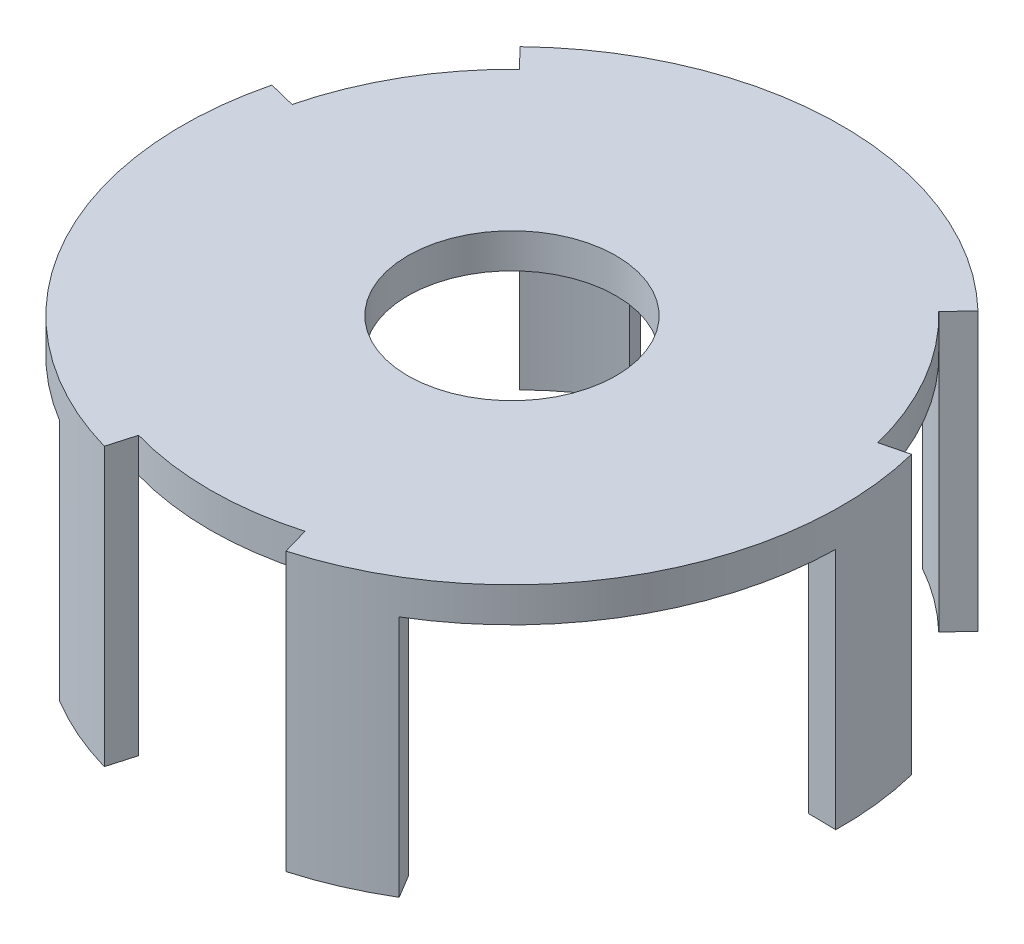
ISO-10303-21;
HEADER;
FILE_DESCRIPTION(('STEP AP214'),'2;1');
FILE_NAME('part.step','',(''),(''),'','','');
FILE_SCHEMA(('AUTOMOTIVE_DESIGN { 1 0 10303 214 1 1 1 1 }'));
ENDSEC;
DATA;
#1=APPLICATION_CONTEXT('core data for automotive mechanical design processes');
#2=APPLICATION_PROTOCOL_DEFINITION('international standard','automotive_design',2000,#1);
#3=PRODUCT_CONTEXT('',#1,'mechanical');
#4=PRODUCT('Part','Part','',(#3));
#5=PRODUCT_RELATED_PRODUCT_CATEGORY('part','',(#4));
#6=PRODUCT_DEFINITION_FORMATION('','',#4);
#7=PRODUCT_DEFINITION_CONTEXT('part definition',#1,'design');
#8=PRODUCT_DEFINITION('design','',#6,#7);
#9=PRODUCT_DEFINITION_SHAPE('','',#8);
#10=(LENGTH_UNIT() NAMED_UNIT(*) SI_UNIT(.MILLI.,.METRE.));
#11=(NAMED_UNIT(*) PLANE_ANGLE_UNIT() SI_UNIT($,.RADIAN.));
#12=(NAMED_UNIT(*) SI_UNIT($,.STERADIAN.) SOLID_ANGLE_UNIT());
#13=UNCERTAINTY_MEASURE_WITH_UNIT(LENGTH_MEASURE(1.E-05),#10,'distance_accuracy_value','');
#14=(GEOMETRIC_REPRESENTATION_CONTEXT(3) GLOBAL_UNCERTAINTY_ASSIGNED_CONTEXT((#13)) GLOBAL_UNIT_ASSIGNED_CONTEXT((#10,
#11,#12)) REPRESENTATION_CONTEXT('',''));
#15=CARTESIAN_POINT('',(0.,0.,0.));
#16=DIRECTION('',(0.,0.,1.));
#17=DIRECTION('',(1.,0.,0.));
#18=AXIS2_PLACEMENT_3D('',#15,#16,#17);
#19=CARTESIAN_POINT('',(0.,35.,0.));
#20=DIRECTION('',(0.,1.,0.));
#21=DIRECTION('',(0.,0.,1.));
#22=AXIS2_PLACEMENT_3D('',#19,#20,#21);
#23=PLANE('',#22);
#24=CARTESIAN_POINT('',(0.,35.,0.));
#25=DIRECTION('',(0.,1.,0.));
#26=DIRECTION('',(0.,0.,1.));
#27=AXIS2_PLACEMENT_3D('',#24,#25,#26);
#28=CIRCLE('',#27,15.);
#29=CARTESIAN_POINT('',(0.,35.,15.));
#30=VERTEX_POINT('',#29);
#31=EDGE_CURVE('E249',#30,#30,#28,.T.);
#32=ORIENTED_EDGE('',*,*,#31,.T.);
#33=EDGE_LOOP('',(#32));
#34=FACE_BOUND('',#33,.T.);
#35=CARTESIAN_POINT('',(0.,35.,0.));
#36=DIRECTION('',(0.,1.,0.));
#37=DIRECTION('',(0.,0.,-1.));
#38=AXIS2_PLACEMENT_3D('',#35,#36,#37);
#39=CIRCLE('',#38,43.5);
#40=CARTESIAN_POINT('',(30.2176391149658,35.,-31.2912813147319));
#41=VERTEX_POINT('',#40);
#42=CARTESIAN_POINT('',(21.0892184807149,35.,-38.0459572605641));
#43=VERTEX_POINT('',#42);
#44=EDGE_CURVE('E233',#41,#43,#39,.T.);
#45=ORIENTED_EDGE('',*,*,#44,.F.);
#46=CARTESIAN_POINT('',(0.,35.,0.));
#47=DIRECTION('',(0.,1.,0.));
#48=DIRECTION('',(0.,0.,-1.));
#49=AXIS2_PLACEMENT_3D('',#46,#47,#48);
#50=CIRCLE('',#49,43.5);
#51=CARTESIAN_POINT('',(42.2078640930058,35.,-10.5236024585857));
#52=VERTEX_POINT('',#51);
#53=EDGE_CURVE('E289',#52,#41,#50,.T.);
#54=ORIENTED_EDGE('',*,*,#53,.F.);
#55=CARTESIAN_POINT('',(0.,35.,0.));
#56=DIRECTION('',(0.,1.,0.));
#57=DIRECTION('',(0.,0.,-1.));
#58=AXIS2_PLACEMENT_3D('',#55,#56,#57);
#59=CIRCLE('',#58,43.5);
#60=CARTESIAN_POINT('',(43.493374739303,35.,0.759179680021701));
#61=VERTEX_POINT('',#60);
#62=EDGE_CURVE('E330',#61,#52,#59,.T.);
#63=ORIENTED_EDGE('',*,*,#62,.F.);
#64=DIRECTION('',(-0.999847695156391,0.,-0.0174524064372791));
#65=VECTOR('',#64,1.);
#66=CARTESIAN_POINT('',(43.493374739303,35.,0.759179680021701));
#67=LINE('',#66,#65);
#68=CARTESIAN_POINT('',(47.4927655199286,35.,0.828989305770817));
#69=VERTEX_POINT('',#68);
#70=EDGE_CURVE('E326',#69,#61,#67,.T.);
#71=ORIENTED_EDGE('',*,*,#70,.F.);
#72=CARTESIAN_POINT('',(0.,35.,0.));
#73=DIRECTION('',(0.,1.,0.));
#74=DIRECTION('',(0.,0.,1.));
#75=AXIS2_PLACEMENT_3D('',#72,#73,#74);
#76=CIRCLE('',#75,47.5);
#77=CARTESIAN_POINT('',(24.4643085582282,35.,40.71544678335));
#78=VERTEX_POINT('',#77);
#79=EDGE_CURVE('E11',#78,#69,#76,.T.);
#80=ORIENTED_EDGE('',*,*,#79,.F.);
#81=DIRECTION('',(0.515038074910067,0.,0.857167300702104));
#82=VECTOR('',#81,1.);
#83=CARTESIAN_POINT('',(22.4041562585879,35.,37.2867775805415));
#84=LINE('',#83,#82);
#85=CARTESIAN_POINT('',(22.4041562585879,35.,37.2867775805415));
#86=VERTEX_POINT('',#85);
#87=EDGE_CURVE('E345',#86,#78,#84,.T.);
#88=ORIENTED_EDGE('',*,*,#87,.F.);
#89=CARTESIAN_POINT('',(0.,35.,0.));
#90=DIRECTION('',(0.,1.,0.));
#91=DIRECTION('',(0.,0.,-1.));
#92=AXIS2_PLACEMENT_3D('',#89,#90,#91);
#93=CIRCLE('',#92,43.5);
#94=CARTESIAN_POINT('',(11.9902249780401,35.,41.8148837733167));
#95=VERTEX_POINT('',#94);
#96=EDGE_CURVE('E333',#95,#86,#93,.T.);
#97=ORIENTED_EDGE('',*,*,#96,.F.);
#98=CARTESIAN_POINT('',(0.,35.,0.));
#99=DIRECTION('',(0.,1.,0.));
#100=DIRECTION('',(0.,0.,-1.));
#101=AXIS2_PLACEMENT_3D('',#98,#99,#100);
#102=CIRCLE('',#101,43.5);
#103=CARTESIAN_POINT('',(-11.9902249780395,35.,41.8148837733169));
#104=VERTEX_POINT('',#103);
#105=EDGE_CURVE('E279',#104,#95,#102,.T.);
#106=ORIENTED_EDGE('',*,*,#105,.F.);
#107=CARTESIAN_POINT('',(0.,35.,0.));
#108=DIRECTION('',(0.,1.,0.));
#109=DIRECTION('',(0.,0.,-1.));
#110=AXIS2_PLACEMENT_3D('',#107,#108,#109);
#111=CIRCLE('',#110,43.5);
#112=CARTESIAN_POINT('',(-22.4041562585874,35.,37.2867775805419));
#113=VERTEX_POINT('',#112);
#114=EDGE_CURVE('E361',#113,#104,#111,.T.);
#115=ORIENTED_EDGE('',*,*,#114,.F.);
#116=DIRECTION('',(0.515038074910055,0.,-0.857167300702112));
#117=VECTOR('',#116,1.);
#118=CARTESIAN_POINT('',(-22.4041562585874,35.,37.2867775805419));
#119=LINE('',#118,#117);
#120=CARTESIAN_POINT('',(-24.4643085582276,35.,40.7154467833503));
#121=VERTEX_POINT('',#120);
#122=EDGE_CURVE('E365',#121,#113,#119,.T.);
#123=ORIENTED_EDGE('',*,*,#122,.F.);
#124=CARTESIAN_POINT('',(-47.4927655199286,35.,0.828989305771475));
#125=VERTEX_POINT('',#124);
#126=EDGE_CURVE('E49',#125,#121,#76,.T.);
#127=ORIENTED_EDGE('',*,*,#126,.F.);
#128=DIRECTION('',(-0.999847695156391,0.,0.0174524064372942));
#129=VECTOR('',#128,1.);
#130=CARTESIAN_POINT('',(-43.493374739303,35.,0.759179680022298));
#131=LINE('',#130,#129);
#132=CARTESIAN_POINT('',(-43.493374739303,35.,0.759179680022298));
#133=VERTEX_POINT('',#132);
#134=EDGE_CURVE('E388',#133,#125,#131,.T.);
#135=ORIENTED_EDGE('',*,*,#134,.F.);
#136=CARTESIAN_POINT('',(0.,35.,0.));
#137=DIRECTION('',(0.,1.,0.));
#138=DIRECTION('',(0.,0.,-1.));
#139=AXIS2_PLACEMENT_3D('',#136,#137,#138);
#140=CIRCLE('',#139,43.5);
#141=CARTESIAN_POINT('',(-42.2078640930059,35.,-10.5236024585851));
#142=VERTEX_POINT('',#141);
#143=EDGE_CURVE('E384',#142,#133,#140,.T.);
#144=ORIENTED_EDGE('',*,*,#143,.F.);
#145=CARTESIAN_POINT('',(0.,35.,0.));
#146=DIRECTION('',(0.,1.,0.));
#147=DIRECTION('',(0.,0.,-1.));
#148=AXIS2_PLACEMENT_3D('',#145,#146,#147);
#149=CIRCLE('',#148,43.5);
#150=CARTESIAN_POINT('',(-30.2176391149667,35.,-31.2912813147311));
#151=VERTEX_POINT('',#150);
#152=EDGE_CURVE('E257',#151,#142,#149,.T.);
#153=ORIENTED_EDGE('',*,*,#152,.F.);
#154=CARTESIAN_POINT('',(0.,35.,0.));
#155=DIRECTION('',(0.,1.,0.));
#156=DIRECTION('',(0.,0.,-1.));
#157=AXIS2_PLACEMENT_3D('',#154,#155,#156);
#158=CIRCLE('',#157,43.5);
#159=CARTESIAN_POINT('',(-21.089218480716,35.,-38.0459572605635));
#160=VERTEX_POINT('',#159);
#161=EDGE_CURVE('E405',#160,#151,#158,.T.);
#162=ORIENTED_EDGE('',*,*,#161,.F.);
#163=DIRECTION('',(0.484809620246344,0.,0.874619707139392));
#164=VECTOR('',#163,1.);
#165=CARTESIAN_POINT('',(-21.089218480716,35.,-38.0459572605635));
#166=LINE('',#165,#164);
#167=CARTESIAN_POINT('',(-23.0284569617014,35.,-41.5444360891211));
#168=VERTEX_POINT('',#167);
#169=EDGE_CURVE('E244',#168,#160,#166,.T.);
#170=ORIENTED_EDGE('',*,*,#169,.F.);
#171=CARTESIAN_POINT('',(23.0284569617002,35.,-41.5444360891218));
#172=VERTEX_POINT('',#171);
#173=EDGE_CURVE('E48',#172,#168,#76,.T.);
#174=ORIENTED_EDGE('',*,*,#173,.F.);
#175=DIRECTION('',(0.48480962024632,0.,-0.874619707139405));
#176=VECTOR('',#175,1.);
#177=CARTESIAN_POINT('',(21.0892184807149,35.,-38.0459572605641));
#178=LINE('',#177,#176);
#179=EDGE_CURVE('E222',#43,#172,#178,.T.);
#180=ORIENTED_EDGE('',*,*,#179,.F.);
#181=EDGE_LOOP('',(#45,#54,#63,#71,#80,#88,#97,#106,#115,#123,#127,#135,#144,#153,#162,#170,
#174,#180));
#182=FACE_BOUND('',#181,.T.);
#183=ADVANCED_FACE('F39',(#34,#182),#23,.F.);
#184=CARTESIAN_POINT('',(0.,35.,0.));
#185=DIRECTION('',(0.,1.,0.));
#186=DIRECTION('',(0.,0.,1.));
#187=AXIS2_PLACEMENT_3D('',#184,#185,#186);
#188=CYLINDRICAL_SURFACE('',#187,47.5);
#189=DIRECTION('',(0.,-1.,0.));
#190=VECTOR('',#189,1.);
#191=CARTESIAN_POINT('',(46.0890469981098,40.,-11.4912900409844));
#192=LINE('',#191,#190);
#193=CARTESIAN_POINT('',(46.0890469981098,40.,-11.4912900409844));
#194=VERTEX_POINT('',#193);
#195=CARTESIAN_POINT('',(46.0890469981098,0.,-11.4912900409844));
#196=VERTEX_POINT('',#195);
#197=EDGE_CURVE('E304',#194,#196,#192,.T.);
#198=ORIENTED_EDGE('',*,*,#197,.F.);
#199=CARTESIAN_POINT('',(0.,40.,0.));
#200=DIRECTION('',(0.,1.,0.));
#201=DIRECTION('',(0.,0.,1.));
#202=AXIS2_PLACEMENT_3D('',#199,#200,#201);
#203=CIRCLE('',#202,47.5);
#204=CARTESIAN_POINT('',(13.0927744013075,40.,45.6599305570701));
#205=VERTEX_POINT('',#204);
#206=EDGE_CURVE('E43',#205,#194,#203,.T.);
#207=ORIENTED_EDGE('',*,*,#206,.F.);
#208=DIRECTION('',(0.,-1.,0.));
#209=VECTOR('',#208,1.);
#210=CARTESIAN_POINT('',(13.0927744013075,40.,45.6599305570701));
#211=LINE('',#210,#209);
#212=CARTESIAN_POINT('',(13.0927744013081,0.,45.6599305570699));
#213=VERTEX_POINT('',#212);
#214=EDGE_CURVE('E294',#205,#213,#211,.T.);
#215=ORIENTED_EDGE('',*,*,#214,.T.);
#216=CARTESIAN_POINT('',(0.,0.,0.));
#217=DIRECTION('',(0.,-1.,0.));
#218=DIRECTION('',(0.,0.,-1.));
#219=AXIS2_PLACEMENT_3D('',#216,#217,#218);
#220=CIRCLE('',#219,47.5);
#221=CARTESIAN_POINT('',(24.4643085582282,0.,40.71544678335));
#222=VERTEX_POINT('',#221);
#223=EDGE_CURVE('E342',#222,#213,#220,.T.);
#224=ORIENTED_EDGE('',*,*,#223,.F.);
#225=DIRECTION('',(0.,1.,0.));
#226=VECTOR('',#225,1.);
#227=CARTESIAN_POINT('',(24.4643085582282,0.,40.71544678335));
#228=LINE('',#227,#226);
#229=EDGE_CURVE('E352',#222,#78,#228,.T.);
#230=ORIENTED_EDGE('',*,*,#229,.T.);
#231=ORIENTED_EDGE('',*,*,#79,.T.);
#232=DIRECTION('',(0.,1.,0.));
#233=VECTOR('',#232,1.);
#234=CARTESIAN_POINT('',(47.4927655199286,0.,0.828989305770818));
#235=LINE('',#234,#233);
#236=CARTESIAN_POINT('',(47.4927655199286,0.,0.828989305770818));
#237=VERTEX_POINT('',#236);
#238=EDGE_CURVE('E319',#237,#69,#235,.T.);
#239=ORIENTED_EDGE('',*,*,#238,.F.);
#240=CARTESIAN_POINT('',(0.,0.,0.));
#241=DIRECTION('',(0.,-1.,0.));
#242=DIRECTION('',(0.,0.,-1.));
#243=AXIS2_PLACEMENT_3D('',#240,#241,#242);
#244=CIRCLE('',#243,47.5);
#245=EDGE_CURVE('E335',#196,#237,#244,.T.);
#246=ORIENTED_EDGE('',*,*,#245,.F.);
#247=EDGE_LOOP('',(#198,#207,#215,#224,#230,#231,#239,#246));
#248=FACE_BOUND('',#247,.T.);
#249=ADVANCED_FACE('F459',(#248),#188,.T.);
#250=DIRECTION('',(0.,-1.,0.));
#251=VECTOR('',#250,1.);
#252=CARTESIAN_POINT('',(-13.0927744013075,40.,45.6599305570701));
#253=LINE('',#252,#251);
#254=CARTESIAN_POINT('',(-13.0927744013075,40.,45.6599305570701));
#255=VERTEX_POINT('',#254);
#256=CARTESIAN_POINT('',(-13.0927744013075,0.,45.6599305570701));
#257=VERTEX_POINT('',#256);
#258=EDGE_CURVE('E292',#255,#257,#253,.T.);
#259=ORIENTED_EDGE('',*,*,#258,.F.);
#260=CARTESIAN_POINT('',(-46.0890469981099,40.,-11.4912900409838));
#261=VERTEX_POINT('',#260);
#262=EDGE_CURVE('E253',#261,#255,#203,.T.);
#263=ORIENTED_EDGE('',*,*,#262,.F.);
#264=DIRECTION('',(0.,-1.,0.));
#265=VECTOR('',#264,1.);
#266=CARTESIAN_POINT('',(-46.0890469981099,40.,-11.4912900409838));
#267=LINE('',#266,#265);
#268=CARTESIAN_POINT('',(-46.0890469981099,0.,-11.4912900409838));
#269=VERTEX_POINT('',#268);
#270=EDGE_CURVE('E62',#261,#269,#267,.T.);
#271=ORIENTED_EDGE('',*,*,#270,.T.);
#272=CARTESIAN_POINT('',(0.,0.,0.));
#273=DIRECTION('',(0.,-1.,0.));
#274=DIRECTION('',(0.,0.,-1.));
#275=AXIS2_PLACEMENT_3D('',#272,#273,#274);
#276=CIRCLE('',#275,47.5);
#277=CARTESIAN_POINT('',(-47.4927655199286,0.,0.828989305771475));
#278=VERTEX_POINT('',#277);
#279=EDGE_CURVE('E385',#278,#269,#276,.T.);
#280=ORIENTED_EDGE('',*,*,#279,.F.);
#281=DIRECTION('',(0.,1.,0.));
#282=VECTOR('',#281,1.);
#283=CARTESIAN_POINT('',(-47.4927655199286,0.,0.828989305771475));
#284=LINE('',#283,#282);
#285=EDGE_CURVE('E395',#278,#125,#284,.T.);
#286=ORIENTED_EDGE('',*,*,#285,.T.);
#287=ORIENTED_EDGE('',*,*,#126,.T.);
#288=DIRECTION('',(0.,1.,0.));
#289=VECTOR('',#288,1.);
#290=CARTESIAN_POINT('',(-24.4643085582276,0.,40.7154467833503));
#291=LINE('',#290,#289);
#292=CARTESIAN_POINT('',(-24.4643085582276,0.,40.7154467833503));
#293=VERTEX_POINT('',#292);
#294=EDGE_CURVE('E378',#293,#121,#291,.T.);
#295=ORIENTED_EDGE('',*,*,#294,.F.);
#296=CARTESIAN_POINT('',(0.,0.,0.));
#297=DIRECTION('',(0.,-1.,0.));
#298=DIRECTION('',(0.,0.,-1.));
#299=AXIS2_PLACEMENT_3D('',#296,#297,#298);
#300=CIRCLE('',#299,47.5);
#301=EDGE_CURVE('E369',#257,#293,#300,.T.);
#302=ORIENTED_EDGE('',*,*,#301,.F.);
#303=EDGE_LOOP('',(#259,#263,#271,#280,#286,#287,#295,#302));
#304=FACE_BOUND('',#303,.T.);
#305=ADVANCED_FACE('F483',(#304),#188,.T.);
#306=DIRECTION('',(0.,-1.,0.));
#307=VECTOR('',#306,1.);
#308=CARTESIAN_POINT('',(32.9962725968022,40.,-34.1686405160861));
#309=LINE('',#308,#307);
#310=CARTESIAN_POINT('',(32.9962725968022,40.,-34.1686405160861));
#311=VERTEX_POINT('',#310);
#312=CARTESIAN_POINT('',(32.9962725968017,0.,-34.1686405160866));
#313=VERTEX_POINT('',#312);
#314=EDGE_CURVE('E301',#311,#313,#309,.T.);
#315=ORIENTED_EDGE('',*,*,#314,.T.);
#316=CARTESIAN_POINT('',(0.,0.,0.));
#317=DIRECTION('',(0.,-1.,0.));
#318=DIRECTION('',(0.,0.,-1.));
#319=AXIS2_PLACEMENT_3D('',#316,#317,#318);
#320=CIRCLE('',#319,47.5);
#321=CARTESIAN_POINT('',(23.0284569617002,0.,-41.5444360891218));
#322=VERTEX_POINT('',#321);
#323=EDGE_CURVE('E234',#322,#313,#320,.T.);
#324=ORIENTED_EDGE('',*,*,#323,.F.);
#325=DIRECTION('',(0.,1.,0.));
#326=VECTOR('',#325,1.);
#327=CARTESIAN_POINT('',(23.0284569617002,0.,-41.5444360891218));
#328=LINE('',#327,#326);
#329=EDGE_CURVE('E226',#322,#172,#328,.T.);
#330=ORIENTED_EDGE('',*,*,#329,.T.);
#331=ORIENTED_EDGE('',*,*,#173,.T.);
#332=DIRECTION('',(0.,1.,0.));
#333=VECTOR('',#332,1.);
#334=CARTESIAN_POINT('',(-23.0284569617014,0.,-41.5444360891211));
#335=LINE('',#334,#333);
#336=CARTESIAN_POINT('',(-23.0284569617014,0.,-41.5444360891211));
#337=VERTEX_POINT('',#336);
#338=EDGE_CURVE('E421',#337,#168,#335,.T.);
#339=ORIENTED_EDGE('',*,*,#338,.F.);
#340=CARTESIAN_POINT('',(0.,0.,0.));
#341=DIRECTION('',(0.,-1.,0.));
#342=DIRECTION('',(0.,0.,-1.));
#343=AXIS2_PLACEMENT_3D('',#340,#341,#342);
#344=CIRCLE('',#343,47.5);
#345=CARTESIAN_POINT('',(-32.9962725968027,0.,-34.1686405160856));
#346=VERTEX_POINT('',#345);
#347=EDGE_CURVE('E412',#346,#337,#344,.T.);
#348=ORIENTED_EDGE('',*,*,#347,.F.);
#349=DIRECTION('',(0.,-1.,0.));
#350=VECTOR('',#349,1.);
#351=CARTESIAN_POINT('',(-32.9962725968027,40.,-34.1686405160856));
#352=LINE('',#351,#350);
#353=CARTESIAN_POINT('',(-32.9962725968027,40.,-34.1686405160856));
#354=VERTEX_POINT('',#353);
#355=EDGE_CURVE('E270',#354,#346,#352,.T.);
#356=ORIENTED_EDGE('',*,*,#355,.F.);
#357=EDGE_CURVE('E499',#311,#354,#203,.T.);
#358=ORIENTED_EDGE('',*,*,#357,.F.);
#359=EDGE_LOOP('',(#315,#324,#330,#331,#339,#348,#356,#358));
#360=FACE_BOUND('',#359,.T.);
#361=ADVANCED_FACE('F41',(#360),#188,.T.);
#362=CARTESIAN_POINT('',(0.,40.,0.));
#363=DIRECTION('',(0.,1.,0.));
#364=DIRECTION('',(0.,0.,1.));
#365=AXIS2_PLACEMENT_3D('',#362,#363,#364);
#366=PLANE('',#365);
#367=DIRECTION('',(-0.970295726275996,0.,0.241921895599671));
#368=VECTOR('',#367,1.);
#369=CARTESIAN_POINT('',(42.2078640930058,40.,-10.5236024585857));
#370=LINE('',#369,#368);
#371=CARTESIAN_POINT('',(42.2078640930058,40.,-10.5236024585857));
#372=VERTEX_POINT('',#371);
#373=EDGE_CURVE('E302',#194,#372,#370,.T.);
#374=ORIENTED_EDGE('',*,*,#373,.T.);
#375=CARTESIAN_POINT('',(0.,40.,0.));
#376=DIRECTION('',(0.,1.,0.));
#377=DIRECTION('',(0.,0.,-1.));
#378=AXIS2_PLACEMENT_3D('',#375,#376,#377);
#379=CIRCLE('',#378,43.5);
#380=CARTESIAN_POINT('',(30.2176391149662,40.,-31.2912813147315));
#381=VERTEX_POINT('',#380);
#382=EDGE_CURVE('E309',#372,#381,#379,.T.);
#383=ORIENTED_EDGE('',*,*,#382,.T.);
#384=DIRECTION('',(0.694658370458992,0.,-0.719339800338656));
#385=VECTOR('',#384,1.);
#386=CARTESIAN_POINT('',(30.2176391149662,40.,-31.2912813147315));
#387=LINE('',#386,#385);
#388=EDGE_CURVE('E312',#381,#311,#387,.T.);
#389=ORIENTED_EDGE('',*,*,#388,.T.);
#390=ORIENTED_EDGE('',*,*,#357,.T.);
#391=DIRECTION('',(0.694658370459003,0.,0.719339800338646));
#392=VECTOR('',#391,1.);
#393=CARTESIAN_POINT('',(-30.2176391149667,40.,-31.2912813147311));
#394=LINE('',#393,#392);
#395=CARTESIAN_POINT('',(-30.2176391149667,40.,-31.2912813147311));
#396=VERTEX_POINT('',#395);
#397=EDGE_CURVE('E260',#354,#396,#394,.T.);
#398=ORIENTED_EDGE('',*,*,#397,.T.);
#399=CARTESIAN_POINT('',(0.,40.,0.));
#400=DIRECTION('',(0.,1.,0.));
#401=DIRECTION('',(0.,0.,-1.));
#402=AXIS2_PLACEMENT_3D('',#399,#400,#401);
#403=CIRCLE('',#402,43.5);
#404=CARTESIAN_POINT('',(-42.2078640930059,40.,-10.5236024585851));
#405=VERTEX_POINT('',#404);
#406=EDGE_CURVE('E254',#396,#405,#403,.T.);
#407=ORIENTED_EDGE('',*,*,#406,.T.);
#408=DIRECTION('',(-0.970295726275999,0.,-0.241921895599658));
#409=VECTOR('',#408,1.);
#410=CARTESIAN_POINT('',(-42.2078640930059,40.,-10.5236024585851));
#411=LINE('',#410,#409);
#412=EDGE_CURVE('E258',#405,#261,#411,.T.);
#413=ORIENTED_EDGE('',*,*,#412,.T.);
#414=ORIENTED_EDGE('',*,*,#262,.T.);
#415=DIRECTION('',(0.275637355817,0.,-0.961261695938319));
#416=VECTOR('',#415,1.);
#417=CARTESIAN_POINT('',(-11.9902249780395,40.,41.8148837733169));
#418=LINE('',#417,#416);
#419=CARTESIAN_POINT('',(-11.9902249780395,40.,41.8148837733169));
#420=VERTEX_POINT('',#419);
#421=EDGE_CURVE('E283',#255,#420,#418,.T.);
#422=ORIENTED_EDGE('',*,*,#421,.T.);
#423=CARTESIAN_POINT('',(0.,40.,0.));
#424=DIRECTION('',(0.,1.,0.));
#425=DIRECTION('',(0.,0.,-1.));
#426=AXIS2_PLACEMENT_3D('',#423,#424,#425);
#427=CIRCLE('',#426,43.5);
#428=CARTESIAN_POINT('',(11.9902249780395,40.,41.8148837733169));
#429=VERTEX_POINT('',#428);
#430=EDGE_CURVE('E276',#420,#429,#427,.T.);
#431=ORIENTED_EDGE('',*,*,#430,.T.);
#432=DIRECTION('',(0.275637355817,0.,0.961261695938319));
#433=VECTOR('',#432,1.);
#434=CARTESIAN_POINT('',(11.9902249780395,40.,41.8148837733169));
#435=LINE('',#434,#433);
#436=EDGE_CURVE('E280',#429,#205,#435,.T.);
#437=ORIENTED_EDGE('',*,*,#436,.T.);
#438=ORIENTED_EDGE('',*,*,#206,.T.);
#439=EDGE_LOOP('',(#374,#383,#389,#390,#398,#407,#413,#414,#422,#431,#437,#438));
#440=FACE_BOUND('',#439,.T.);
#441=CARTESIAN_POINT('',(0.,40.,0.));
#442=DIRECTION('',(0.,1.,0.));
#443=DIRECTION('',(0.,0.,1.));
#444=AXIS2_PLACEMENT_3D('',#441,#442,#443);
#445=CIRCLE('',#444,15.);
#446=CARTESIAN_POINT('',(0.,40.,15.));
#447=VERTEX_POINT('',#446);
#448=EDGE_CURVE('E246',#447,#447,#445,.T.);
#449=ORIENTED_EDGE('',*,*,#448,.F.);
#450=EDGE_LOOP('',(#449));
#451=FACE_BOUND('',#450,.T.);
#452=ADVANCED_FACE('F487',(#440,#451),#366,.T.);
#453=CARTESIAN_POINT('',(0.,35.,0.));
#454=DIRECTION('',(0.,1.,0.));
#455=DIRECTION('',(0.,0.,1.));
#456=AXIS2_PLACEMENT_3D('',#453,#454,#455);
#457=CYLINDRICAL_SURFACE('',#456,15.);
#458=ORIENTED_EDGE('',*,*,#31,.F.);
#459=EDGE_LOOP('',(#458));
#460=FACE_BOUND('',#459,.T.);
#461=ORIENTED_EDGE('',*,*,#448,.T.);
#462=EDGE_LOOP('',(#461));
#463=FACE_BOUND('',#462,.T.);
#464=ADVANCED_FACE('F485',(#460,#463),#457,.F.);
#465=CARTESIAN_POINT('',(0.,40.,0.));
#466=DIRECTION('',(0.,-1.,0.));
#467=DIRECTION('',(0.,0.,-1.));
#468=AXIS2_PLACEMENT_3D('',#465,#466,#467);
#469=CYLINDRICAL_SURFACE('',#468,43.5);
#470=ORIENTED_EDGE('',*,*,#152,.T.);
#471=DIRECTION('',(0.,-1.,0.));
#472=VECTOR('',#471,1.);
#473=CARTESIAN_POINT('',(-42.2078640930059,40.,-10.5236024585851));
#474=LINE('',#473,#472);
#475=EDGE_CURVE('E263',#405,#142,#474,.T.);
#476=ORIENTED_EDGE('',*,*,#475,.F.);
#477=ORIENTED_EDGE('',*,*,#406,.F.);
#478=DIRECTION('',(0.,-1.,0.));
#479=VECTOR('',#478,1.);
#480=CARTESIAN_POINT('',(-30.2176391149667,40.,-31.2912813147311));
#481=LINE('',#480,#479);
#482=EDGE_CURVE('E267',#396,#151,#481,.T.);
#483=ORIENTED_EDGE('',*,*,#482,.T.);
#484=EDGE_LOOP('',(#470,#476,#477,#483));
#485=FACE_BOUND('',#484,.T.);
#486=ADVANCED_FACE('F492',(#485),#469,.T.);
#487=CARTESIAN_POINT('',(-30.2176391149667,40.,-31.2912813147311));
#488=DIRECTION('',(0.719339800338646,0.,-0.694658370459003));
#489=DIRECTION('',(-0.694658370459003,0.,-0.719339800338646));
#490=AXIS2_PLACEMENT_3D('',#487,#488,#489);
#491=PLANE('',#490);
#492=ORIENTED_EDGE('',*,*,#355,.T.);
#493=DIRECTION('',(-0.694658370459003,0.,-0.719339800338646));
#494=VECTOR('',#493,1.);
#495=CARTESIAN_POINT('',(-30.2176391149667,0.,-31.2912813147311));
#496=LINE('',#495,#494);
#497=CARTESIAN_POINT('',(-30.2176391149667,0.,-31.2912813147311));
#498=VERTEX_POINT('',#497);
#499=EDGE_CURVE('E409',#498,#346,#496,.T.);
#500=ORIENTED_EDGE('',*,*,#499,.F.);
#501=DIRECTION('',(0.,1.,0.));
#502=VECTOR('',#501,1.);
#503=CARTESIAN_POINT('',(-30.2176391149667,0.,-31.2912813147311));
#504=LINE('',#503,#502);
#505=EDGE_CURVE('E423',#498,#151,#504,.T.);
#506=ORIENTED_EDGE('',*,*,#505,.T.);
#507=ORIENTED_EDGE('',*,*,#482,.F.);
#508=ORIENTED_EDGE('',*,*,#397,.F.);
#509=EDGE_LOOP('',(#492,#500,#506,#507,#508));
#510=FACE_BOUND('',#509,.T.);
#511=ADVANCED_FACE('F734',(#510),#491,.F.);
#512=CARTESIAN_POINT('',(-42.2078640930059,40.,-10.5236024585851));
#513=DIRECTION('',(-0.241921895599658,0.,0.970295726275999));
#514=DIRECTION('',(0.970295726275999,0.,0.241921895599658));
#515=AXIS2_PLACEMENT_3D('',#512,#513,#514);
#516=PLANE('',#515);
#517=ORIENTED_EDGE('',*,*,#475,.T.);
#518=DIRECTION('',(0.,1.,0.));
#519=VECTOR('',#518,1.);
#520=CARTESIAN_POINT('',(-42.2078640930059,0.,-10.5236024585851));
#521=LINE('',#520,#519);
#522=CARTESIAN_POINT('',(-42.2078640930059,0.,-10.5236024585851));
#523=VERTEX_POINT('',#522);
#524=EDGE_CURVE('E403',#523,#142,#521,.T.);
#525=ORIENTED_EDGE('',*,*,#524,.F.);
#526=DIRECTION('',(0.970295726275999,0.,0.241921895599658));
#527=VECTOR('',#526,1.);
#528=CARTESIAN_POINT('',(-42.2078640930059,0.,-10.5236024585851));
#529=LINE('',#528,#527);
#530=EDGE_CURVE('E389',#269,#523,#529,.T.);
#531=ORIENTED_EDGE('',*,*,#530,.F.);
#532=ORIENTED_EDGE('',*,*,#270,.F.);
#533=ORIENTED_EDGE('',*,*,#412,.F.);
#534=EDGE_LOOP('',(#517,#525,#531,#532,#533));
#535=FACE_BOUND('',#534,.T.);
#536=ADVANCED_FACE('F726',(#535),#516,.F.);
#537=CARTESIAN_POINT('',(0.,40.,0.));
#538=DIRECTION('',(0.,-1.,0.));
#539=DIRECTION('',(0.,0.,-1.));
#540=AXIS2_PLACEMENT_3D('',#537,#538,#539);
#541=CYLINDRICAL_SURFACE('',#540,43.5);
#542=ORIENTED_EDGE('',*,*,#105,.T.);
#543=DIRECTION('',(0.,-1.,0.));
#544=VECTOR('',#543,1.);
#545=CARTESIAN_POINT('',(11.9902249780395,40.,41.8148837733169));
#546=LINE('',#545,#544);
#547=EDGE_CURVE('E286',#429,#95,#546,.T.);
#548=ORIENTED_EDGE('',*,*,#547,.F.);
#549=ORIENTED_EDGE('',*,*,#430,.F.);
#550=DIRECTION('',(0.,-1.,0.));
#551=VECTOR('',#550,1.);
#552=CARTESIAN_POINT('',(-11.9902249780395,40.,41.8148837733169));
#553=LINE('',#552,#551);
#554=EDGE_CURVE('E266',#420,#104,#553,.T.);
#555=ORIENTED_EDGE('',*,*,#554,.T.);
#556=EDGE_LOOP('',(#542,#548,#549,#555));
#557=FACE_BOUND('',#556,.T.);
#558=ADVANCED_FACE('F522',(#557),#541,.T.);
#559=CARTESIAN_POINT('',(-11.9902249780395,40.,41.8148837733169));
#560=DIRECTION('',(-0.961261695938319,0.,-0.275637355817));
#561=DIRECTION('',(-0.275637355817,0.,0.961261695938319));
#562=AXIS2_PLACEMENT_3D('',#559,#560,#561);
#563=PLANE('',#562);
#564=ORIENTED_EDGE('',*,*,#258,.T.);
#565=DIRECTION('',(-0.275637355817,0.,0.961261695938319));
#566=VECTOR('',#565,1.);
#567=CARTESIAN_POINT('',(-11.9902249780395,0.,41.8148837733169));
#568=LINE('',#567,#566);
#569=CARTESIAN_POINT('',(-11.9902249780395,0.,41.8148837733169));
#570=VERTEX_POINT('',#569);
#571=EDGE_CURVE('E366',#570,#257,#568,.T.);
#572=ORIENTED_EDGE('',*,*,#571,.F.);
#573=DIRECTION('',(0.,1.,0.));
#574=VECTOR('',#573,1.);
#575=CARTESIAN_POINT('',(-11.9902249780395,0.,41.8148837733169));
#576=LINE('',#575,#574);
#577=EDGE_CURVE('E381',#570,#104,#576,.T.);
#578=ORIENTED_EDGE('',*,*,#577,.T.);
#579=ORIENTED_EDGE('',*,*,#554,.F.);
#580=ORIENTED_EDGE('',*,*,#421,.F.);
#581=EDGE_LOOP('',(#564,#572,#578,#579,#580));
#582=FACE_BOUND('',#581,.T.);
#583=ADVANCED_FACE('F509',(#582),#563,.F.);
#584=CARTESIAN_POINT('',(11.9902249780395,40.,41.8148837733169));
#585=DIRECTION('',(0.961261695938319,0.,-0.275637355817));
#586=DIRECTION('',(-0.275637355817,0.,-0.961261695938319));
#587=AXIS2_PLACEMENT_3D('',#584,#585,#586);
#588=PLANE('',#587);
#589=ORIENTED_EDGE('',*,*,#547,.T.);
#590=DIRECTION('',(0.,1.,0.));
#591=VECTOR('',#590,1.);
#592=CARTESIAN_POINT('',(11.9902249780401,0.,41.8148837733167));
#593=LINE('',#592,#591);
#594=CARTESIAN_POINT('',(11.9902249780401,0.,41.8148837733167));
#595=VERTEX_POINT('',#594);
#596=EDGE_CURVE('E359',#595,#95,#593,.T.);
#597=ORIENTED_EDGE('',*,*,#596,.F.);
#598=DIRECTION('',(-0.275637355817014,0.,-0.961261695938315));
#599=VECTOR('',#598,1.);
#600=CARTESIAN_POINT('',(11.9902249780401,0.,41.8148837733167));
#601=LINE('',#600,#599);
#602=EDGE_CURVE('E346',#213,#595,#601,.T.);
#603=ORIENTED_EDGE('',*,*,#602,.F.);
#604=ORIENTED_EDGE('',*,*,#214,.F.);
#605=ORIENTED_EDGE('',*,*,#436,.F.);
#606=EDGE_LOOP('',(#589,#597,#603,#604,#605));
#607=FACE_BOUND('',#606,.T.);
#608=ADVANCED_FACE('F529',(#607),#588,.F.);
#609=CARTESIAN_POINT('',(0.,40.,0.));
#610=DIRECTION('',(0.,-1.,0.));
#611=DIRECTION('',(0.,0.,-1.));
#612=AXIS2_PLACEMENT_3D('',#609,#610,#611);
#613=CYLINDRICAL_SURFACE('',#612,43.5);
#614=ORIENTED_EDGE('',*,*,#53,.T.);
#615=DIRECTION('',(0.,-1.,0.));
#616=VECTOR('',#615,1.);
#617=CARTESIAN_POINT('',(30.2176391149662,40.,-31.2912813147315));
#618=LINE('',#617,#616);
#619=EDGE_CURVE('E298',#381,#41,#618,.T.);
#620=ORIENTED_EDGE('',*,*,#619,.F.);
#621=ORIENTED_EDGE('',*,*,#382,.F.);
#622=DIRECTION('',(0.,-1.,0.));
#623=VECTOR('',#622,1.);
#624=CARTESIAN_POINT('',(42.2078640930058,40.,-10.5236024585857));
#625=LINE('',#624,#623);
#626=EDGE_CURVE('E250',#372,#52,#625,.T.);
#627=ORIENTED_EDGE('',*,*,#626,.T.);
#628=EDGE_LOOP('',(#614,#620,#621,#627));
#629=FACE_BOUND('',#628,.T.);
#630=ADVANCED_FACE('F446',(#629),#613,.T.);
#631=CARTESIAN_POINT('',(42.2078640930058,40.,-10.5236024585857));
#632=DIRECTION('',(0.241921895599671,0.,0.970295726275996));
#633=DIRECTION('',(0.970295726275996,0.,-0.241921895599671));
#634=AXIS2_PLACEMENT_3D('',#631,#632,#633);
#635=PLANE('',#634);
#636=ORIENTED_EDGE('',*,*,#197,.T.);
#637=DIRECTION('',(0.970295726275996,0.,-0.241921895599671));
#638=VECTOR('',#637,1.);
#639=CARTESIAN_POINT('',(42.2078640930058,0.,-10.5236024585857));
#640=LINE('',#639,#638);
#641=CARTESIAN_POINT('',(42.2078640930058,0.,-10.5236024585857));
#642=VERTEX_POINT('',#641);
#643=EDGE_CURVE('E337',#642,#196,#640,.T.);
#644=ORIENTED_EDGE('',*,*,#643,.F.);
#645=DIRECTION('',(0.,1.,0.));
#646=VECTOR('',#645,1.);
#647=CARTESIAN_POINT('',(42.2078640930058,0.,-10.5236024585857));
#648=LINE('',#647,#646);
#649=EDGE_CURVE('E271',#642,#52,#648,.T.);
#650=ORIENTED_EDGE('',*,*,#649,.T.);
#651=ORIENTED_EDGE('',*,*,#626,.F.);
#652=ORIENTED_EDGE('',*,*,#373,.F.);
#653=EDGE_LOOP('',(#636,#644,#650,#651,#652));
#654=FACE_BOUND('',#653,.T.);
#655=ADVANCED_FACE('F448',(#654),#635,.F.);
#656=CARTESIAN_POINT('',(30.2176391149662,40.,-31.2912813147315));
#657=DIRECTION('',(-0.719339800338656,0.,-0.694658370458992));
#658=DIRECTION('',(-0.694658370458992,0.,0.719339800338656));
#659=AXIS2_PLACEMENT_3D('',#656,#657,#658);
#660=PLANE('',#659);
#661=ORIENTED_EDGE('',*,*,#619,.T.);
#662=DIRECTION('',(0.,1.,0.));
#663=VECTOR('',#662,1.);
#664=CARTESIAN_POINT('',(30.2176391149658,0.,-31.2912813147319));
#665=LINE('',#664,#663);
#666=CARTESIAN_POINT('',(30.2176391149658,0.,-31.2912813147319));
#667=VERTEX_POINT('',#666);
#668=EDGE_CURVE('E434',#667,#41,#665,.T.);
#669=ORIENTED_EDGE('',*,*,#668,.F.);
#670=DIRECTION('',(-0.694658370458983,0.,0.719339800338665));
#671=VECTOR('',#670,1.);
#672=CARTESIAN_POINT('',(30.2176391149658,0.,-31.2912813147319));
#673=LINE('',#672,#671);
#674=EDGE_CURVE('E427',#313,#667,#673,.T.);
#675=ORIENTED_EDGE('',*,*,#674,.F.);
#676=ORIENTED_EDGE('',*,*,#314,.F.);
#677=ORIENTED_EDGE('',*,*,#388,.F.);
#678=EDGE_LOOP('',(#661,#669,#675,#676,#677));
#679=FACE_BOUND('',#678,.T.);
#680=ADVANCED_FACE('F443',(#679),#660,.F.);
#681=CARTESIAN_POINT('',(0.,0.,0.));
#682=DIRECTION('',(0.,1.,0.));
#683=DIRECTION('',(0.,0.,1.));
#684=AXIS2_PLACEMENT_3D('',#681,#682,#683);
#685=CYLINDRICAL_SURFACE('',#684,43.5);
#686=ORIENTED_EDGE('',*,*,#62,.T.);
#687=ORIENTED_EDGE('',*,*,#649,.F.);
#688=CARTESIAN_POINT('',(0.,0.,0.));
#689=DIRECTION('',(0.,1.,0.));
#690=DIRECTION('',(0.,0.,-1.));
#691=AXIS2_PLACEMENT_3D('',#688,#689,#690);
#692=CIRCLE('',#691,43.5);
#693=CARTESIAN_POINT('',(43.493374739303,0.,0.759179680021701));
#694=VERTEX_POINT('',#693);
#695=EDGE_CURVE('E329',#694,#642,#692,.T.);
#696=ORIENTED_EDGE('',*,*,#695,.F.);
#697=DIRECTION('',(0.,1.,0.));
#698=VECTOR('',#697,1.);
#699=CARTESIAN_POINT('',(43.493374739303,0.,0.759179680021701));
#700=LINE('',#699,#698);
#701=EDGE_CURVE('E322',#694,#61,#700,.T.);
#702=ORIENTED_EDGE('',*,*,#701,.T.);
#703=EDGE_LOOP('',(#686,#687,#696,#702));
#704=FACE_BOUND('',#703,.T.);
#705=ADVANCED_FACE('F453',(#704),#685,.F.);
#706=CARTESIAN_POINT('',(43.493374739303,0.,0.759179680021701));
#707=DIRECTION('',(0.0174524064372791,0.,-0.999847695156391));
#708=DIRECTION('',(-0.999847695156391,0.,-0.0174524064372791));
#709=AXIS2_PLACEMENT_3D('',#706,#707,#708);
#710=PLANE('',#709);
#711=ORIENTED_EDGE('',*,*,#70,.T.);
#712=ORIENTED_EDGE('',*,*,#701,.F.);
#713=DIRECTION('',(-0.999847695156391,0.,-0.0174524064372791));
#714=VECTOR('',#713,1.);
#715=CARTESIAN_POINT('',(43.493374739303,0.,0.759179680021701));
#716=LINE('',#715,#714);
#717=EDGE_CURVE('E325',#237,#694,#716,.T.);
#718=ORIENTED_EDGE('',*,*,#717,.F.);
#719=ORIENTED_EDGE('',*,*,#238,.T.);
#720=EDGE_LOOP('',(#711,#712,#718,#719));
#721=FACE_BOUND('',#720,.T.);
#722=ADVANCED_FACE('F456',(#721),#710,.F.);
#723=CARTESIAN_POINT('',(0.,0.,0.));
#724=DIRECTION('',(0.,-1.,0.));
#725=DIRECTION('',(0.,0.,-1.));
#726=AXIS2_PLACEMENT_3D('',#723,#724,#725);
#727=PLANE('',#726);
#728=ORIENTED_EDGE('',*,*,#695,.T.);
#729=ORIENTED_EDGE('',*,*,#643,.T.);
#730=ORIENTED_EDGE('',*,*,#245,.T.);
#731=ORIENTED_EDGE('',*,*,#717,.T.);
#732=EDGE_LOOP('',(#728,#729,#730,#731));
#733=FACE_BOUND('',#732,.T.);
#734=ADVANCED_FACE('F463',(#733),#727,.T.);
#735=CARTESIAN_POINT('',(0.,0.,0.));
#736=DIRECTION('',(0.,1.,0.));
#737=DIRECTION('',(0.,0.,1.));
#738=AXIS2_PLACEMENT_3D('',#735,#736,#737);
#739=CYLINDRICAL_SURFACE('',#738,43.5);
#740=ORIENTED_EDGE('',*,*,#96,.T.);
#741=DIRECTION('',(0.,1.,0.));
#742=VECTOR('',#741,1.);
#743=CARTESIAN_POINT('',(22.4041562585879,0.,37.2867775805415));
#744=LINE('',#743,#742);
#745=CARTESIAN_POINT('',(22.4041562585879,0.,37.2867775805415));
#746=VERTEX_POINT('',#745);
#747=EDGE_CURVE('E356',#746,#86,#744,.T.);
#748=ORIENTED_EDGE('',*,*,#747,.F.);
#749=CARTESIAN_POINT('',(0.,0.,0.));
#750=DIRECTION('',(0.,1.,0.));
#751=DIRECTION('',(0.,0.,-1.));
#752=AXIS2_PLACEMENT_3D('',#749,#750,#751);
#753=CIRCLE('',#752,43.5);
#754=EDGE_CURVE('E348',#595,#746,#753,.T.);
#755=ORIENTED_EDGE('',*,*,#754,.F.);
#756=ORIENTED_EDGE('',*,*,#596,.T.);
#757=EDGE_LOOP('',(#740,#748,#755,#756));
#758=FACE_BOUND('',#757,.T.);
#759=ADVANCED_FACE('F465',(#758),#739,.F.);
#760=CARTESIAN_POINT('',(22.4041562585879,0.,37.2867775805415));
#761=DIRECTION('',(-0.857167300702104,0.,0.515038074910067));
#762=DIRECTION('',(0.515038074910067,0.,0.857167300702105));
#763=AXIS2_PLACEMENT_3D('',#760,#761,#762);
#764=PLANE('',#763);
#765=ORIENTED_EDGE('',*,*,#87,.T.);
#766=ORIENTED_EDGE('',*,*,#229,.F.);
#767=DIRECTION('',(0.515038074910067,0.,0.857167300702104));
#768=VECTOR('',#767,1.);
#769=CARTESIAN_POINT('',(22.4041562585879,0.,37.2867775805415));
#770=LINE('',#769,#768);
#771=EDGE_CURVE('E350',#746,#222,#770,.T.);
#772=ORIENTED_EDGE('',*,*,#771,.F.);
#773=ORIENTED_EDGE('',*,*,#747,.T.);
#774=EDGE_LOOP('',(#765,#766,#772,#773));
#775=FACE_BOUND('',#774,.T.);
#776=ADVANCED_FACE('F471',(#775),#764,.F.);
#777=CARTESIAN_POINT('',(0.,0.,0.));
#778=DIRECTION('',(0.,-1.,0.));
#779=DIRECTION('',(0.,0.,-1.));
#780=AXIS2_PLACEMENT_3D('',#777,#778,#779);
#781=PLANE('',#780);
#782=ORIENTED_EDGE('',*,*,#223,.T.);
#783=ORIENTED_EDGE('',*,*,#602,.T.);
#784=ORIENTED_EDGE('',*,*,#754,.T.);
#785=ORIENTED_EDGE('',*,*,#771,.T.);
#786=EDGE_LOOP('',(#782,#783,#784,#785));
#787=FACE_BOUND('',#786,.T.);
#788=ADVANCED_FACE('F535',(#787),#781,.T.);
#789=CARTESIAN_POINT('',(0.,0.,0.));
#790=DIRECTION('',(0.,1.,0.));
#791=DIRECTION('',(0.,0.,1.));
#792=AXIS2_PLACEMENT_3D('',#789,#790,#791);
#793=CYLINDRICAL_SURFACE('',#792,43.5);
#794=ORIENTED_EDGE('',*,*,#114,.T.);
#795=ORIENTED_EDGE('',*,*,#577,.F.);
#796=CARTESIAN_POINT('',(0.,0.,0.));
#797=DIRECTION('',(0.,1.,0.));
#798=DIRECTION('',(0.,0.,-1.));
#799=AXIS2_PLACEMENT_3D('',#796,#797,#798);
#800=CIRCLE('',#799,43.5);
#801=CARTESIAN_POINT('',(-22.4041562585874,0.,37.2867775805419));
#802=VERTEX_POINT('',#801);
#803=EDGE_CURVE('E362',#802,#570,#800,.T.);
#804=ORIENTED_EDGE('',*,*,#803,.F.);
#805=DIRECTION('',(0.,1.,0.));
#806=VECTOR('',#805,1.);
#807=CARTESIAN_POINT('',(-22.4041562585874,0.,37.2867775805419));
#808=LINE('',#807,#806);
#809=EDGE_CURVE('E373',#802,#113,#808,.T.);
#810=ORIENTED_EDGE('',*,*,#809,.T.);
#811=EDGE_LOOP('',(#794,#795,#804,#810));
#812=FACE_BOUND('',#811,.T.);
#813=ADVANCED_FACE('F517',(#812),#793,.F.);
#814=CARTESIAN_POINT('',(-22.4041562585874,0.,37.2867775805419));
#815=DIRECTION('',(0.857167300702112,0.,0.515038074910055));
#816=DIRECTION('',(0.515038074910055,0.,-0.857167300702112));
#817=AXIS2_PLACEMENT_3D('',#814,#815,#816);
#818=PLANE('',#817);
#819=ORIENTED_EDGE('',*,*,#122,.T.);
#820=ORIENTED_EDGE('',*,*,#809,.F.);
#821=DIRECTION('',(0.515038074910055,0.,-0.857167300702112));
#822=VECTOR('',#821,1.);
#823=CARTESIAN_POINT('',(-22.4041562585874,0.,37.2867775805419));
#824=LINE('',#823,#822);
#825=EDGE_CURVE('E371',#293,#802,#824,.T.);
#826=ORIENTED_EDGE('',*,*,#825,.F.);
#827=ORIENTED_EDGE('',*,*,#294,.T.);
#828=EDGE_LOOP('',(#819,#820,#826,#827));
#829=FACE_BOUND('',#828,.T.);
#830=ADVANCED_FACE('F547',(#829),#818,.F.);
#831=CARTESIAN_POINT('',(0.,0.,0.));
#832=DIRECTION('',(0.,-1.,0.));
#833=DIRECTION('',(0.,0.,-1.));
#834=AXIS2_PLACEMENT_3D('',#831,#832,#833);
#835=PLANE('',#834);
#836=ORIENTED_EDGE('',*,*,#803,.T.);
#837=ORIENTED_EDGE('',*,*,#571,.T.);
#838=ORIENTED_EDGE('',*,*,#301,.T.);
#839=ORIENTED_EDGE('',*,*,#825,.T.);
#840=EDGE_LOOP('',(#836,#837,#838,#839));
#841=FACE_BOUND('',#840,.T.);
#842=ADVANCED_FACE('F511',(#841),#835,.T.);
#843=CARTESIAN_POINT('',(0.,0.,0.));
#844=DIRECTION('',(0.,1.,0.));
#845=DIRECTION('',(0.,0.,1.));
#846=AXIS2_PLACEMENT_3D('',#843,#844,#845);
#847=CYLINDRICAL_SURFACE('',#846,43.5);
#848=ORIENTED_EDGE('',*,*,#143,.T.);
#849=DIRECTION('',(0.,1.,0.));
#850=VECTOR('',#849,1.);
#851=CARTESIAN_POINT('',(-43.493374739303,0.,0.759179680022298));
#852=LINE('',#851,#850);
#853=CARTESIAN_POINT('',(-43.493374739303,0.,0.759179680022298));
#854=VERTEX_POINT('',#853);
#855=EDGE_CURVE('E400',#854,#133,#852,.T.);
#856=ORIENTED_EDGE('',*,*,#855,.F.);
#857=CARTESIAN_POINT('',(0.,0.,0.));
#858=DIRECTION('',(0.,1.,0.));
#859=DIRECTION('',(0.,0.,-1.));
#860=AXIS2_PLACEMENT_3D('',#857,#858,#859);
#861=CIRCLE('',#860,43.5);
#862=EDGE_CURVE('E391',#523,#854,#861,.T.);
#863=ORIENTED_EDGE('',*,*,#862,.F.);
#864=ORIENTED_EDGE('',*,*,#524,.T.);
#865=EDGE_LOOP('',(#848,#856,#863,#864));
#866=FACE_BOUND('',#865,.T.);
#867=ADVANCED_FACE('F546',(#866),#847,.F.);
#868=CARTESIAN_POINT('',(-43.493374739303,0.,0.759179680022298));
#869=DIRECTION('',(-0.0174524064372942,0.,-0.999847695156391));
#870=DIRECTION('',(-0.999847695156391,0.,0.0174524064372942));
#871=AXIS2_PLACEMENT_3D('',#868,#869,#870);
#872=PLANE('',#871);
#873=ORIENTED_EDGE('',*,*,#134,.T.);
#874=ORIENTED_EDGE('',*,*,#285,.F.);
#875=DIRECTION('',(-0.999847695156391,0.,0.0174524064372942));
#876=VECTOR('',#875,1.);
#877=CARTESIAN_POINT('',(-43.493374739303,0.,0.759179680022298));
#878=LINE('',#877,#876);
#879=EDGE_CURVE('E393',#854,#278,#878,.T.);
#880=ORIENTED_EDGE('',*,*,#879,.F.);
#881=ORIENTED_EDGE('',*,*,#855,.T.);
#882=EDGE_LOOP('',(#873,#874,#880,#881));
#883=FACE_BOUND('',#882,.T.);
#884=ADVANCED_FACE('F557',(#883),#872,.F.);
#885=CARTESIAN_POINT('',(0.,0.,0.));
#886=DIRECTION('',(0.,-1.,0.));
#887=DIRECTION('',(0.,0.,-1.));
#888=AXIS2_PLACEMENT_3D('',#885,#886,#887);
#889=PLANE('',#888);
#890=ORIENTED_EDGE('',*,*,#279,.T.);
#891=ORIENTED_EDGE('',*,*,#530,.T.);
#892=ORIENTED_EDGE('',*,*,#862,.T.);
#893=ORIENTED_EDGE('',*,*,#879,.T.);
#894=EDGE_LOOP('',(#890,#891,#892,#893));
#895=FACE_BOUND('',#894,.T.);
#896=ADVANCED_FACE('F553',(#895),#889,.T.);
#897=CARTESIAN_POINT('',(0.,0.,0.));
#898=DIRECTION('',(0.,1.,0.));
#899=DIRECTION('',(0.,0.,1.));
#900=AXIS2_PLACEMENT_3D('',#897,#898,#899);
#901=CYLINDRICAL_SURFACE('',#900,43.5);
#902=ORIENTED_EDGE('',*,*,#161,.T.);
#903=ORIENTED_EDGE('',*,*,#505,.F.);
#904=CARTESIAN_POINT('',(0.,0.,0.));
#905=DIRECTION('',(0.,1.,0.));
#906=DIRECTION('',(0.,0.,-1.));
#907=AXIS2_PLACEMENT_3D('',#904,#905,#906);
#908=CIRCLE('',#907,43.5);
#909=CARTESIAN_POINT('',(-21.089218480716,0.,-38.0459572605635));
#910=VERTEX_POINT('',#909);
#911=EDGE_CURVE('E406',#910,#498,#908,.T.);
#912=ORIENTED_EDGE('',*,*,#911,.F.);
#913=DIRECTION('',(0.,1.,0.));
#914=VECTOR('',#913,1.);
#915=CARTESIAN_POINT('',(-21.089218480716,0.,-38.0459572605635));
#916=LINE('',#915,#914);
#917=EDGE_CURVE('E416',#910,#160,#916,.T.);
#918=ORIENTED_EDGE('',*,*,#917,.T.);
#919=EDGE_LOOP('',(#902,#903,#912,#918));
#920=FACE_BOUND('',#919,.T.);
#921=ADVANCED_FACE('F556',(#920),#901,.F.);
#922=CARTESIAN_POINT('',(-21.089218480716,0.,-38.0459572605635));
#923=DIRECTION('',(-0.874619707139392,0.,0.484809620246344));
#924=DIRECTION('',(0.484809620246344,0.,0.874619707139392));
#925=AXIS2_PLACEMENT_3D('',#922,#923,#924);
#926=PLANE('',#925);
#927=ORIENTED_EDGE('',*,*,#169,.T.);
#928=ORIENTED_EDGE('',*,*,#917,.F.);
#929=DIRECTION('',(0.484809620246344,0.,0.874619707139392));
#930=VECTOR('',#929,1.);
#931=CARTESIAN_POINT('',(-21.089218480716,0.,-38.0459572605635));
#932=LINE('',#931,#930);
#933=EDGE_CURVE('E414',#337,#910,#932,.T.);
#934=ORIENTED_EDGE('',*,*,#933,.F.);
#935=ORIENTED_EDGE('',*,*,#338,.T.);
#936=EDGE_LOOP('',(#927,#928,#934,#935));
#937=FACE_BOUND('',#936,.T.);
#938=ADVANCED_FACE('F568',(#937),#926,.F.);
#939=CARTESIAN_POINT('',(0.,0.,0.));
#940=DIRECTION('',(0.,-1.,0.));
#941=DIRECTION('',(0.,0.,-1.));
#942=AXIS2_PLACEMENT_3D('',#939,#940,#941);
#943=PLANE('',#942);
#944=ORIENTED_EDGE('',*,*,#911,.T.);
#945=ORIENTED_EDGE('',*,*,#499,.T.);
#946=ORIENTED_EDGE('',*,*,#347,.T.);
#947=ORIENTED_EDGE('',*,*,#933,.T.);
#948=EDGE_LOOP('',(#944,#945,#946,#947));
#949=FACE_BOUND('',#948,.T.);
#950=ADVANCED_FACE('F565',(#949),#943,.T.);
#951=CARTESIAN_POINT('',(0.,0.,0.));
#952=DIRECTION('',(0.,1.,0.));
#953=DIRECTION('',(0.,0.,1.));
#954=AXIS2_PLACEMENT_3D('',#951,#952,#953);
#955=CYLINDRICAL_SURFACE('',#954,43.5);
#956=ORIENTED_EDGE('',*,*,#44,.T.);
#957=DIRECTION('',(0.,1.,0.));
#958=VECTOR('',#957,1.);
#959=CARTESIAN_POINT('',(21.0892184807149,0.,-38.0459572605641));
#960=LINE('',#959,#958);
#961=CARTESIAN_POINT('',(21.0892184807149,0.,-38.0459572605641));
#962=VERTEX_POINT('',#961);
#963=EDGE_CURVE('E229',#962,#43,#960,.T.);
#964=ORIENTED_EDGE('',*,*,#963,.F.);
#965=CARTESIAN_POINT('',(0.,0.,0.));
#966=DIRECTION('',(0.,1.,0.));
#967=DIRECTION('',(0.,0.,-1.));
#968=AXIS2_PLACEMENT_3D('',#965,#966,#967);
#969=CIRCLE('',#968,43.5);
#970=EDGE_CURVE('E429',#667,#962,#969,.T.);
#971=ORIENTED_EDGE('',*,*,#970,.F.);
#972=ORIENTED_EDGE('',*,*,#668,.T.);
#973=EDGE_LOOP('',(#956,#964,#971,#972));
#974=FACE_BOUND('',#973,.T.);
#975=ADVANCED_FACE('F438',(#974),#955,.F.);
#976=CARTESIAN_POINT('',(21.0892184807149,0.,-38.0459572605641));
#977=DIRECTION('',(0.874619707139405,0.,0.48480962024632));
#978=DIRECTION('',(0.48480962024632,0.,-0.874619707139405));
#979=AXIS2_PLACEMENT_3D('',#976,#977,#978);
#980=PLANE('',#979);
#981=ORIENTED_EDGE('',*,*,#179,.T.);
#982=ORIENTED_EDGE('',*,*,#329,.F.);
#983=DIRECTION('',(0.48480962024632,0.,-0.874619707139405));
#984=VECTOR('',#983,1.);
#985=CARTESIAN_POINT('',(21.0892184807149,0.,-38.0459572605641));
#986=LINE('',#985,#984);
#987=EDGE_CURVE('E240',#962,#322,#986,.T.);
#988=ORIENTED_EDGE('',*,*,#987,.F.);
#989=ORIENTED_EDGE('',*,*,#963,.T.);
#990=EDGE_LOOP('',(#981,#982,#988,#989));
#991=FACE_BOUND('',#990,.T.);
#992=ADVANCED_FACE('F224',(#991),#980,.F.);
#993=CARTESIAN_POINT('',(0.,0.,0.));
#994=DIRECTION('',(0.,-1.,0.));
#995=DIRECTION('',(0.,0.,-1.));
#996=AXIS2_PLACEMENT_3D('',#993,#994,#995);
#997=PLANE('',#996);
#998=ORIENTED_EDGE('',*,*,#323,.T.);
#999=ORIENTED_EDGE('',*,*,#674,.T.);
#1000=ORIENTED_EDGE('',*,*,#970,.T.);
#1001=ORIENTED_EDGE('',*,*,#987,.T.);
#1002=EDGE_LOOP('',(#998,#999,#1000,#1001));
#1003=FACE_BOUND('',#1002,.T.);
#1004=ADVANCED_FACE('F576',(#1003),#997,.T.);
#1005=CLOSED_SHELL('',(#183,#249,#305,#361,#452,#464,#486,#511,#536,#558,#583,#608,#630,#655,
#680,#705,#722,#734,#759,#776,#788,#813,#830,#842,#867,#884,#896,#921,#938,#950,#975,#992,#1004));
#1006=MANIFOLD_SOLID_BREP('B2',#1005);
#1007=ADVANCED_BREP_SHAPE_REPRESENTATION('',(#18,#1006),#14);
#1008=SHAPE_DEFINITION_REPRESENTATION(#9,#1007);
ENDSEC;
END-ISO-10303-21;
